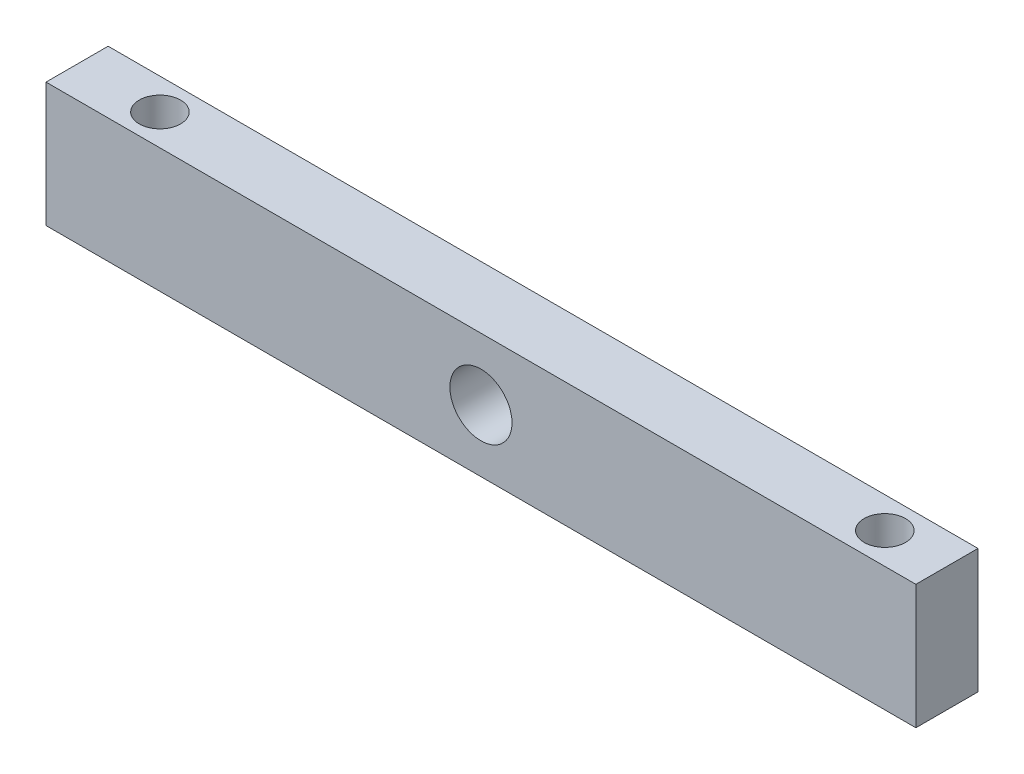
ISO-10303-21;
HEADER;
FILE_DESCRIPTION(('STEP AP214'),'2;1');
FILE_NAME('part.step','',(''),(''),'','','');
FILE_SCHEMA(('AUTOMOTIVE_DESIGN { 1 0 10303 214 1 1 1 1 }'));
ENDSEC;
DATA;
#1=APPLICATION_CONTEXT('core data for automotive mechanical design processes');
#2=APPLICATION_PROTOCOL_DEFINITION('international standard','automotive_design',2000,#1);
#3=PRODUCT_CONTEXT('',#1,'mechanical');
#4=PRODUCT('Part','Part','',(#3));
#5=PRODUCT_RELATED_PRODUCT_CATEGORY('part','',(#4));
#6=PRODUCT_DEFINITION_FORMATION('','',#4);
#7=PRODUCT_DEFINITION_CONTEXT('part definition',#1,'design');
#8=PRODUCT_DEFINITION('design','',#6,#7);
#9=PRODUCT_DEFINITION_SHAPE('','',#8);
#10=(LENGTH_UNIT() NAMED_UNIT(*) SI_UNIT(.MILLI.,.METRE.));
#11=(NAMED_UNIT(*) PLANE_ANGLE_UNIT() SI_UNIT($,.RADIAN.));
#12=(NAMED_UNIT(*) SI_UNIT($,.STERADIAN.) SOLID_ANGLE_UNIT());
#13=UNCERTAINTY_MEASURE_WITH_UNIT(LENGTH_MEASURE(1.E-05),#10,'distance_accuracy_value','');
#14=(GEOMETRIC_REPRESENTATION_CONTEXT(3) GLOBAL_UNCERTAINTY_ASSIGNED_CONTEXT((#13)) GLOBAL_UNIT_ASSIGNED_CONTEXT((#10,
#11,#12)) REPRESENTATION_CONTEXT('',''));
#15=CARTESIAN_POINT('',(0.,0.,0.));
#16=DIRECTION('',(0.,0.,1.));
#17=DIRECTION('',(1.,0.,0.));
#18=AXIS2_PLACEMENT_3D('',#15,#16,#17);
#19=CARTESIAN_POINT('',(0.,0.,15.));
#20=DIRECTION('',(0.,1.,0.));
#21=DIRECTION('',(0.,0.,1.));
#22=AXIS2_PLACEMENT_3D('',#19,#20,#21);
#23=PLANE('',#22);
#24=CARTESIAN_POINT('',(-130.,0.,7.5));
#25=DIRECTION('',(0.,-1.,0.));
#26=DIRECTION('',(0.,0.,-1.));
#27=AXIS2_PLACEMENT_3D('',#24,#25,#26);
#28=CIRCLE('',#27,5.00000000000002);
#29=CARTESIAN_POINT('',(-130.,0.,2.49999999999998));
#30=VERTEX_POINT('',#29);
#31=EDGE_CURVE('E150',#30,#30,#28,.T.);
#32=ORIENTED_EDGE('',*,*,#31,.F.);
#33=EDGE_LOOP('',(#32));
#34=FACE_BOUND('',#33,.T.);
#35=CARTESIAN_POINT('',(45.,0.,7.5));
#36=DIRECTION('',(0.,-1.,0.));
#37=DIRECTION('',(0.,0.,-1.));
#38=AXIS2_PLACEMENT_3D('',#35,#36,#37);
#39=CIRCLE('',#38,5.);
#40=CARTESIAN_POINT('',(45.,0.,2.5));
#41=VERTEX_POINT('',#40);
#42=EDGE_CURVE('E154',#41,#41,#39,.T.);
#43=ORIENTED_EDGE('',*,*,#42,.F.);
#44=EDGE_LOOP('',(#43));
#45=FACE_BOUND('',#44,.T.);
#46=DIRECTION('',(1.,0.,0.));
#47=VECTOR('',#46,1.);
#48=CARTESIAN_POINT('',(0.,0.,0.));
#49=LINE('',#48,#47);
#50=CARTESIAN_POINT('',(-150.,0.,0.));
#51=VERTEX_POINT('',#50);
#52=CARTESIAN_POINT('',(60.,0.,0.));
#53=VERTEX_POINT('',#52);
#54=EDGE_CURVE('E82',#51,#53,#49,.T.);
#55=ORIENTED_EDGE('',*,*,#54,.T.);
#56=DIRECTION('',(0.,0.,-1.));
#57=VECTOR('',#56,1.);
#58=CARTESIAN_POINT('',(60.,0.,15.));
#59=LINE('',#58,#57);
#60=CARTESIAN_POINT('',(60.,0.,15.));
#61=VERTEX_POINT('',#60);
#62=EDGE_CURVE('E11',#61,#53,#59,.T.);
#63=ORIENTED_EDGE('',*,*,#62,.F.);
#64=DIRECTION('',(1.,0.,0.));
#65=VECTOR('',#64,1.);
#66=CARTESIAN_POINT('',(-150.,0.,15.));
#67=LINE('',#66,#65);
#68=CARTESIAN_POINT('',(-150.,0.,15.));
#69=VERTEX_POINT('',#68);
#70=EDGE_CURVE('E87',#69,#61,#67,.T.);
#71=ORIENTED_EDGE('',*,*,#70,.F.);
#72=DIRECTION('',(0.,0.,-1.));
#73=VECTOR('',#72,1.);
#74=CARTESIAN_POINT('',(-150.,0.,15.));
#75=LINE('',#74,#73);
#76=EDGE_CURVE('E106',#69,#51,#75,.T.);
#77=ORIENTED_EDGE('',*,*,#76,.T.);
#78=EDGE_LOOP('',(#55,#63,#71,#77));
#79=FACE_BOUND('',#78,.T.);
#80=ADVANCED_FACE('F41',(#34,#45,#79),#23,.F.);
#81=CARTESIAN_POINT('',(60.,0.,15.));
#82=DIRECTION('',(-1.,0.,0.));
#83=DIRECTION('',(0.,0.,1.));
#84=AXIS2_PLACEMENT_3D('',#81,#82,#83);
#85=PLANE('',#84);
#86=DIRECTION('',(0.,1.,0.));
#87=VECTOR('',#86,1.);
#88=CARTESIAN_POINT('',(60.,0.,0.));
#89=LINE('',#88,#87);
#90=CARTESIAN_POINT('',(60.,30.,0.));
#91=VERTEX_POINT('',#90);
#92=EDGE_CURVE('E99',#53,#91,#89,.T.);
#93=ORIENTED_EDGE('',*,*,#92,.T.);
#94=DIRECTION('',(0.,0.,-1.));
#95=VECTOR('',#94,1.);
#96=CARTESIAN_POINT('',(60.,30.,15.));
#97=LINE('',#96,#95);
#98=CARTESIAN_POINT('',(60.,30.,15.));
#99=VERTEX_POINT('',#98);
#100=EDGE_CURVE('E50',#99,#91,#97,.T.);
#101=ORIENTED_EDGE('',*,*,#100,.F.);
#102=DIRECTION('',(0.,1.,0.));
#103=VECTOR('',#102,1.);
#104=CARTESIAN_POINT('',(60.,0.,15.));
#105=LINE('',#104,#103);
#106=EDGE_CURVE('E90',#61,#99,#105,.T.);
#107=ORIENTED_EDGE('',*,*,#106,.F.);
#108=ORIENTED_EDGE('',*,*,#62,.T.);
#109=EDGE_LOOP('',(#93,#101,#107,#108));
#110=FACE_BOUND('',#109,.T.);
#111=ADVANCED_FACE('F98',(#110),#85,.F.);
#112=CARTESIAN_POINT('',(60.,30.,15.));
#113=DIRECTION('',(0.,-1.,0.));
#114=DIRECTION('',(1.,0.,0.));
#115=AXIS2_PLACEMENT_3D('',#112,#113,#114);
#116=PLANE('',#115);
#117=CARTESIAN_POINT('',(-130.,30.,7.5));
#118=DIRECTION('',(0.,-1.,0.));
#119=DIRECTION('',(0.,0.,-1.));
#120=AXIS2_PLACEMENT_3D('',#117,#118,#119);
#121=CIRCLE('',#120,5.00000000000002);
#122=CARTESIAN_POINT('',(-130.,30.,2.49999999999998));
#123=VERTEX_POINT('',#122);
#124=EDGE_CURVE('E161',#123,#123,#121,.T.);
#125=ORIENTED_EDGE('',*,*,#124,.T.);
#126=EDGE_LOOP('',(#125));
#127=FACE_BOUND('',#126,.T.);
#128=CARTESIAN_POINT('',(45.,30.,7.5));
#129=DIRECTION('',(0.,-1.,0.));
#130=DIRECTION('',(0.,0.,-1.));
#131=AXIS2_PLACEMENT_3D('',#128,#129,#130);
#132=CIRCLE('',#131,5.);
#133=CARTESIAN_POINT('',(45.,30.,2.5));
#134=VERTEX_POINT('',#133);
#135=EDGE_CURVE('E166',#134,#134,#132,.T.);
#136=ORIENTED_EDGE('',*,*,#135,.T.);
#137=EDGE_LOOP('',(#136));
#138=FACE_BOUND('',#137,.T.);
#139=DIRECTION('',(-1.,0.,0.));
#140=VECTOR('',#139,1.);
#141=CARTESIAN_POINT('',(60.,30.,0.));
#142=LINE('',#141,#140);
#143=CARTESIAN_POINT('',(-150.,30.,0.));
#144=VERTEX_POINT('',#143);
#145=EDGE_CURVE('E75',#91,#144,#142,.T.);
#146=ORIENTED_EDGE('',*,*,#145,.T.);
#147=DIRECTION('',(0.,0.,-1.));
#148=VECTOR('',#147,1.);
#149=CARTESIAN_POINT('',(-150.,30.,15.));
#150=LINE('',#149,#148);
#151=CARTESIAN_POINT('',(-150.,30.,15.));
#152=VERTEX_POINT('',#151);
#153=EDGE_CURVE('E101',#152,#144,#150,.T.);
#154=ORIENTED_EDGE('',*,*,#153,.F.);
#155=DIRECTION('',(-1.,0.,0.));
#156=VECTOR('',#155,1.);
#157=CARTESIAN_POINT('',(60.,30.,15.));
#158=LINE('',#157,#156);
#159=EDGE_CURVE('E94',#99,#152,#158,.T.);
#160=ORIENTED_EDGE('',*,*,#159,.F.);
#161=ORIENTED_EDGE('',*,*,#100,.T.);
#162=EDGE_LOOP('',(#146,#154,#160,#161));
#163=FACE_BOUND('',#162,.T.);
#164=ADVANCED_FACE('F102',(#127,#138,#163),#116,.F.);
#165=CARTESIAN_POINT('',(-150.,30.,15.));
#166=DIRECTION('',(1.,0.,0.));
#167=DIRECTION('',(0.,1.,0.));
#168=AXIS2_PLACEMENT_3D('',#165,#166,#167);
#169=PLANE('',#168);
#170=DIRECTION('',(0.,-1.,0.));
#171=VECTOR('',#170,1.);
#172=CARTESIAN_POINT('',(-150.,30.,0.));
#173=LINE('',#172,#171);
#174=EDGE_CURVE('E117',#144,#51,#173,.T.);
#175=ORIENTED_EDGE('',*,*,#174,.T.);
#176=ORIENTED_EDGE('',*,*,#76,.F.);
#177=DIRECTION('',(0.,-1.,0.));
#178=VECTOR('',#177,1.);
#179=CARTESIAN_POINT('',(-150.,30.,15.));
#180=LINE('',#179,#178);
#181=EDGE_CURVE('E58',#152,#69,#180,.T.);
#182=ORIENTED_EDGE('',*,*,#181,.F.);
#183=ORIENTED_EDGE('',*,*,#153,.T.);
#184=EDGE_LOOP('',(#175,#176,#182,#183));
#185=FACE_BOUND('',#184,.T.);
#186=ADVANCED_FACE('F125',(#185),#169,.F.);
#187=CARTESIAN_POINT('',(0.,0.,15.));
#188=DIRECTION('',(0.,0.,1.));
#189=DIRECTION('',(1.,0.,0.));
#190=AXIS2_PLACEMENT_3D('',#187,#188,#189);
#191=PLANE('',#190);
#192=CARTESIAN_POINT('',(-45.,15.,15.));
#193=DIRECTION('',(0.,0.,1.));
#194=DIRECTION('',(1.,0.,0.));
#195=AXIS2_PLACEMENT_3D('',#192,#193,#194);
#196=CIRCLE('',#195,7.5);
#197=CARTESIAN_POINT('',(-37.5,15.,15.));
#198=VERTEX_POINT('',#197);
#199=EDGE_CURVE('E157',#198,#198,#196,.T.);
#200=ORIENTED_EDGE('',*,*,#199,.F.);
#201=EDGE_LOOP('',(#200));
#202=FACE_BOUND('',#201,.T.);
#203=ORIENTED_EDGE('',*,*,#70,.T.);
#204=ORIENTED_EDGE('',*,*,#106,.T.);
#205=ORIENTED_EDGE('',*,*,#159,.T.);
#206=ORIENTED_EDGE('',*,*,#181,.T.);
#207=EDGE_LOOP('',(#203,#204,#205,#206));
#208=FACE_BOUND('',#207,.T.);
#209=ADVANCED_FACE('F92',(#202,#208),#191,.T.);
#210=CARTESIAN_POINT('',(0.,0.,0.));
#211=DIRECTION('',(0.,0.,1.));
#212=DIRECTION('',(1.,0.,0.));
#213=AXIS2_PLACEMENT_3D('',#210,#211,#212);
#214=PLANE('',#213);
#215=CARTESIAN_POINT('',(-45.,15.,0.));
#216=DIRECTION('',(0.,0.,1.));
#217=DIRECTION('',(1.,0.,0.));
#218=AXIS2_PLACEMENT_3D('',#215,#216,#217);
#219=CIRCLE('',#218,7.5);
#220=CARTESIAN_POINT('',(-37.5,15.,0.));
#221=VERTEX_POINT('',#220);
#222=EDGE_CURVE('E112',#221,#221,#219,.T.);
#223=ORIENTED_EDGE('',*,*,#222,.T.);
#224=EDGE_LOOP('',(#223));
#225=FACE_BOUND('',#224,.T.);
#226=ORIENTED_EDGE('',*,*,#54,.F.);
#227=ORIENTED_EDGE('',*,*,#174,.F.);
#228=ORIENTED_EDGE('',*,*,#145,.F.);
#229=ORIENTED_EDGE('',*,*,#92,.F.);
#230=EDGE_LOOP('',(#226,#227,#228,#229));
#231=FACE_BOUND('',#230,.T.);
#232=ADVANCED_FACE('F126',(#225,#231),#214,.F.);
#233=CARTESIAN_POINT('',(-45.,15.,0.));
#234=DIRECTION('',(0.,0.,1.));
#235=DIRECTION('',(1.,0.,0.));
#236=AXIS2_PLACEMENT_3D('',#233,#234,#235);
#237=CYLINDRICAL_SURFACE('',#236,7.5);
#238=ORIENTED_EDGE('',*,*,#222,.F.);
#239=EDGE_LOOP('',(#238));
#240=FACE_BOUND('',#239,.T.);
#241=ORIENTED_EDGE('',*,*,#199,.T.);
#242=EDGE_LOOP('',(#241));
#243=FACE_BOUND('',#242,.T.);
#244=ADVANCED_FACE('F128',(#240,#243),#237,.F.);
#245=CARTESIAN_POINT('',(45.,30.,7.5));
#246=DIRECTION('',(0.,-1.,0.));
#247=DIRECTION('',(0.,0.,-1.));
#248=AXIS2_PLACEMENT_3D('',#245,#246,#247);
#249=CYLINDRICAL_SURFACE('',#248,5.);
#250=ORIENTED_EDGE('',*,*,#135,.F.);
#251=EDGE_LOOP('',(#250));
#252=FACE_BOUND('',#251,.T.);
#253=ORIENTED_EDGE('',*,*,#42,.T.);
#254=EDGE_LOOP('',(#253));
#255=FACE_BOUND('',#254,.T.);
#256=ADVANCED_FACE('F135',(#252,#255),#249,.F.);
#257=CARTESIAN_POINT('',(-130.,30.,7.5));
#258=DIRECTION('',(0.,-1.,0.));
#259=DIRECTION('',(0.,0.,-1.));
#260=AXIS2_PLACEMENT_3D('',#257,#258,#259);
#261=CYLINDRICAL_SURFACE('',#260,5.00000000000002);
#262=ORIENTED_EDGE('',*,*,#124,.F.);
#263=EDGE_LOOP('',(#262));
#264=FACE_BOUND('',#263,.T.);
#265=ORIENTED_EDGE('',*,*,#31,.T.);
#266=EDGE_LOOP('',(#265));
#267=FACE_BOUND('',#266,.T.);
#268=ADVANCED_FACE('F178',(#264,#267),#261,.F.);
#269=CLOSED_SHELL('',(#80,#111,#164,#186,#209,#232,#244,#256,#268));
#270=MANIFOLD_SOLID_BREP('B2',#269);
#271=ADVANCED_BREP_SHAPE_REPRESENTATION('',(#18,#270),#14);
#272=SHAPE_DEFINITION_REPRESENTATION(#9,#271);
ENDSEC;
END-ISO-10303-21;
